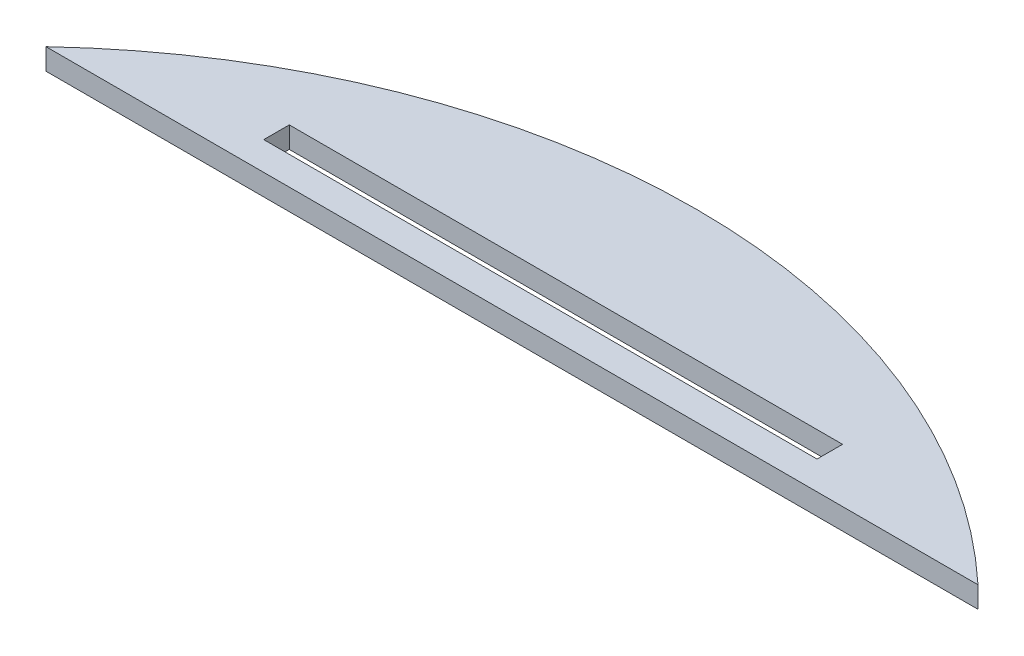
ISO-10303-21;
HEADER;
FILE_DESCRIPTION(('STEP AP214'),'2;1');
FILE_NAME('part.step','',(''),(''),'','','');
FILE_SCHEMA(('AUTOMOTIVE_DESIGN { 1 0 10303 214 1 1 1 1 }'));
ENDSEC;
DATA;
#1=APPLICATION_CONTEXT('core data for automotive mechanical design processes');
#2=APPLICATION_PROTOCOL_DEFINITION('international standard','automotive_design',2000,#1);
#3=PRODUCT_CONTEXT('',#1,'mechanical');
#4=PRODUCT('Part','Part','',(#3));
#5=PRODUCT_RELATED_PRODUCT_CATEGORY('part','',(#4));
#6=PRODUCT_DEFINITION_FORMATION('','',#4);
#7=PRODUCT_DEFINITION_CONTEXT('part definition',#1,'design');
#8=PRODUCT_DEFINITION('design','',#6,#7);
#9=PRODUCT_DEFINITION_SHAPE('','',#8);
#10=(LENGTH_UNIT() NAMED_UNIT(*) SI_UNIT(.MILLI.,.METRE.));
#11=(NAMED_UNIT(*) PLANE_ANGLE_UNIT() SI_UNIT($,.RADIAN.));
#12=(NAMED_UNIT(*) SI_UNIT($,.STERADIAN.) SOLID_ANGLE_UNIT());
#13=UNCERTAINTY_MEASURE_WITH_UNIT(LENGTH_MEASURE(1.E-05),#10,'distance_accuracy_value','');
#14=(GEOMETRIC_REPRESENTATION_CONTEXT(3) GLOBAL_UNCERTAINTY_ASSIGNED_CONTEXT((#13)) GLOBAL_UNIT_ASSIGNED_CONTEXT((#10,
#11,#12)) REPRESENTATION_CONTEXT('',''));
#15=CARTESIAN_POINT('',(0.,0.,0.));
#16=DIRECTION('',(0.,0.,1.));
#17=DIRECTION('',(1.,0.,0.));
#18=AXIS2_PLACEMENT_3D('',#15,#16,#17);
#19=CARTESIAN_POINT('',(0.,1.5,0.));
#20=DIRECTION('',(0.,-1.,0.));
#21=DIRECTION('',(0.,0.,-1.));
#22=AXIS2_PLACEMENT_3D('',#19,#20,#21);
#23=CYLINDRICAL_SURFACE('',#22,48.);
#24=CARTESIAN_POINT('',(0.,1.5,0.));
#25=DIRECTION('',(0.,1.,0.));
#26=DIRECTION('',(0.,0.,1.));
#27=AXIS2_PLACEMENT_3D('',#24,#25,#26);
#28=CIRCLE('',#27,48.);
#29=CARTESIAN_POINT('',(32.8481354113137,1.5,-35.));
#30=VERTEX_POINT('',#29);
#31=CARTESIAN_POINT('',(-32.8481354113137,1.5,-35.));
#32=VERTEX_POINT('',#31);
#33=EDGE_CURVE('E11',#30,#32,#28,.T.);
#34=ORIENTED_EDGE('',*,*,#33,.F.);
#35=DIRECTION('',(0.,1.,0.));
#36=VECTOR('',#35,1.);
#37=CARTESIAN_POINT('',(32.8481354113137,-126.905476635171,-35.));
#38=LINE('',#37,#36);
#39=CARTESIAN_POINT('',(32.8481354113137,0.,-35.));
#40=VERTEX_POINT('',#39);
#41=EDGE_CURVE('E134',#40,#30,#38,.T.);
#42=ORIENTED_EDGE('',*,*,#41,.F.);
#43=CARTESIAN_POINT('',(0.,0.,0.));
#44=DIRECTION('',(0.,1.,0.));
#45=DIRECTION('',(0.,0.,1.));
#46=AXIS2_PLACEMENT_3D('',#43,#44,#45);
#47=CIRCLE('',#46,48.);
#48=CARTESIAN_POINT('',(-32.8481354113137,0.,-35.));
#49=VERTEX_POINT('',#48);
#50=EDGE_CURVE('E41',#40,#49,#47,.T.);
#51=ORIENTED_EDGE('',*,*,#50,.T.);
#52=DIRECTION('',(0.,1.,0.));
#53=VECTOR('',#52,1.);
#54=CARTESIAN_POINT('',(-32.8481354113137,-126.905476635171,-35.));
#55=LINE('',#54,#53);
#56=EDGE_CURVE('E135',#49,#32,#55,.T.);
#57=ORIENTED_EDGE('',*,*,#56,.T.);
#58=EDGE_LOOP('',(#34,#42,#51,#57));
#59=FACE_BOUND('',#58,.T.);
#60=ADVANCED_FACE('F38',(#59),#23,.T.);
#61=CARTESIAN_POINT('',(0.,1.5,0.));
#62=DIRECTION('',(0.,1.,0.));
#63=DIRECTION('',(0.,0.,1.));
#64=AXIS2_PLACEMENT_3D('',#61,#62,#63);
#65=PLANE('',#64);
#66=DIRECTION('',(0.,0.,-1.));
#67=VECTOR('',#66,1.);
#68=CARTESIAN_POINT('',(19.5,1.5,-38.8));
#69=LINE('',#68,#67);
#70=CARTESIAN_POINT('',(19.5,1.5,-37.));
#71=VERTEX_POINT('',#70);
#72=CARTESIAN_POINT('',(19.5,1.5,-38.8));
#73=VERTEX_POINT('',#72);
#74=EDGE_CURVE('E53',#71,#73,#69,.T.);
#75=ORIENTED_EDGE('',*,*,#74,.F.);
#76=DIRECTION('',(1.,0.,0.));
#77=VECTOR('',#76,1.);
#78=CARTESIAN_POINT('',(19.5,1.5,-37.));
#79=LINE('',#78,#77);
#80=CARTESIAN_POINT('',(-19.5,1.5,-37.));
#81=VERTEX_POINT('',#80);
#82=EDGE_CURVE('E112',#81,#71,#79,.T.);
#83=ORIENTED_EDGE('',*,*,#82,.F.);
#84=DIRECTION('',(0.,0.,1.));
#85=VECTOR('',#84,1.);
#86=CARTESIAN_POINT('',(-19.5,1.5,-38.8));
#87=LINE('',#86,#85);
#88=CARTESIAN_POINT('',(-19.5,1.5,-38.8));
#89=VERTEX_POINT('',#88);
#90=EDGE_CURVE('E94',#89,#81,#87,.T.);
#91=ORIENTED_EDGE('',*,*,#90,.F.);
#92=DIRECTION('',(-1.,0.,0.));
#93=VECTOR('',#92,1.);
#94=CARTESIAN_POINT('',(19.5,1.5,-38.8));
#95=LINE('',#94,#93);
#96=EDGE_CURVE('E104',#73,#89,#95,.T.);
#97=ORIENTED_EDGE('',*,*,#96,.F.);
#98=EDGE_LOOP('',(#75,#83,#91,#97));
#99=FACE_BOUND('',#98,.T.);
#100=DIRECTION('',(-1.,0.,0.));
#101=VECTOR('',#100,1.);
#102=CARTESIAN_POINT('',(-32.8481354113137,1.5,-35.));
#103=LINE('',#102,#101);
#104=EDGE_CURVE('E130',#30,#32,#103,.T.);
#105=ORIENTED_EDGE('',*,*,#104,.F.);
#106=ORIENTED_EDGE('',*,*,#33,.T.);
#107=EDGE_LOOP('',(#105,#106));
#108=FACE_BOUND('',#107,.T.);
#109=ADVANCED_FACE('F109',(#99,#108),#65,.T.);
#110=CARTESIAN_POINT('',(0.,0.,0.));
#111=DIRECTION('',(0.,1.,0.));
#112=DIRECTION('',(0.,0.,1.));
#113=AXIS2_PLACEMENT_3D('',#110,#111,#112);
#114=PLANE('',#113);
#115=DIRECTION('',(-1.,0.,0.));
#116=VECTOR('',#115,1.);
#117=CARTESIAN_POINT('',(19.5,0.,-37.));
#118=LINE('',#117,#116);
#119=CARTESIAN_POINT('',(19.5,0.,-37.));
#120=VERTEX_POINT('',#119);
#121=CARTESIAN_POINT('',(-19.5,0.,-37.));
#122=VERTEX_POINT('',#121);
#123=EDGE_CURVE('E240',#120,#122,#118,.T.);
#124=ORIENTED_EDGE('',*,*,#123,.F.);
#125=DIRECTION('',(0.,0.,1.));
#126=VECTOR('',#125,1.);
#127=CARTESIAN_POINT('',(19.5,0.,-38.8));
#128=LINE('',#127,#126);
#129=CARTESIAN_POINT('',(19.5,0.,-38.8));
#130=VERTEX_POINT('',#129);
#131=EDGE_CURVE('E131',#130,#120,#128,.T.);
#132=ORIENTED_EDGE('',*,*,#131,.F.);
#133=DIRECTION('',(1.,0.,0.));
#134=VECTOR('',#133,1.);
#135=CARTESIAN_POINT('',(19.5,0.,-38.8));
#136=LINE('',#135,#134);
#137=CARTESIAN_POINT('',(-19.5,0.,-38.8));
#138=VERTEX_POINT('',#137);
#139=EDGE_CURVE('E127',#138,#130,#136,.T.);
#140=ORIENTED_EDGE('',*,*,#139,.F.);
#141=DIRECTION('',(0.,0.,-1.));
#142=VECTOR('',#141,1.);
#143=CARTESIAN_POINT('',(-19.5,0.,-38.8));
#144=LINE('',#143,#142);
#145=EDGE_CURVE('E97',#122,#138,#144,.T.);
#146=ORIENTED_EDGE('',*,*,#145,.F.);
#147=EDGE_LOOP('',(#124,#132,#140,#146));
#148=FACE_BOUND('',#147,.T.);
#149=ORIENTED_EDGE('',*,*,#50,.F.);
#150=DIRECTION('',(1.,0.,0.));
#151=VECTOR('',#150,1.);
#152=CARTESIAN_POINT('',(-32.8481354113137,0.,-35.));
#153=LINE('',#152,#151);
#154=EDGE_CURVE('E139',#49,#40,#153,.T.);
#155=ORIENTED_EDGE('',*,*,#154,.F.);
#156=EDGE_LOOP('',(#149,#155));
#157=FACE_BOUND('',#156,.T.);
#158=ADVANCED_FACE('F154',(#148,#157),#114,.F.);
#159=CARTESIAN_POINT('',(-32.8481354113137,-126.905476635171,-35.));
#160=DIRECTION('',(0.,0.,-1.));
#161=DIRECTION('',(-1.,0.,0.));
#162=AXIS2_PLACEMENT_3D('',#159,#160,#161);
#163=PLANE('',#162);
#164=ORIENTED_EDGE('',*,*,#154,.T.);
#165=ORIENTED_EDGE('',*,*,#41,.T.);
#166=ORIENTED_EDGE('',*,*,#104,.T.);
#167=ORIENTED_EDGE('',*,*,#56,.F.);
#168=EDGE_LOOP('',(#164,#165,#166,#167));
#169=FACE_BOUND('',#168,.T.);
#170=ADVANCED_FACE('F156',(#169),#163,.F.);
#171=CARTESIAN_POINT('',(19.5,-39.0415163639939,-38.8));
#172=DIRECTION('',(1.,0.,0.));
#173=DIRECTION('',(0.,0.,-1.));
#174=AXIS2_PLACEMENT_3D('',#171,#172,#173);
#175=PLANE('',#174);
#176=ORIENTED_EDGE('',*,*,#131,.T.);
#177=DIRECTION('',(0.,1.,0.));
#178=VECTOR('',#177,1.);
#179=CARTESIAN_POINT('',(19.5,-39.0415163639939,-37.));
#180=LINE('',#179,#178);
#181=EDGE_CURVE('E120',#120,#71,#180,.T.);
#182=ORIENTED_EDGE('',*,*,#181,.T.);
#183=ORIENTED_EDGE('',*,*,#74,.T.);
#184=DIRECTION('',(0.,1.,0.));
#185=VECTOR('',#184,1.);
#186=CARTESIAN_POINT('',(19.5,-39.0415163639939,-38.8));
#187=LINE('',#186,#185);
#188=EDGE_CURVE('E101',#130,#73,#187,.T.);
#189=ORIENTED_EDGE('',*,*,#188,.F.);
#190=EDGE_LOOP('',(#176,#182,#183,#189));
#191=FACE_BOUND('',#190,.T.);
#192=ADVANCED_FACE('F162',(#191),#175,.F.);
#193=CARTESIAN_POINT('',(19.5,-39.0415163639939,-37.));
#194=DIRECTION('',(0.,0.,1.));
#195=DIRECTION('',(1.,0.,0.));
#196=AXIS2_PLACEMENT_3D('',#193,#194,#195);
#197=PLANE('',#196);
#198=ORIENTED_EDGE('',*,*,#123,.T.);
#199=DIRECTION('',(0.,1.,0.));
#200=VECTOR('',#199,1.);
#201=CARTESIAN_POINT('',(-19.5,-39.0415163639939,-37.));
#202=LINE('',#201,#200);
#203=EDGE_CURVE('E100',#122,#81,#202,.T.);
#204=ORIENTED_EDGE('',*,*,#203,.T.);
#205=ORIENTED_EDGE('',*,*,#82,.T.);
#206=ORIENTED_EDGE('',*,*,#181,.F.);
#207=EDGE_LOOP('',(#198,#204,#205,#206));
#208=FACE_BOUND('',#207,.T.);
#209=ADVANCED_FACE('F192',(#208),#197,.F.);
#210=CARTESIAN_POINT('',(-19.5,-39.0415163639939,-38.8));
#211=DIRECTION('',(-1.,0.,0.));
#212=DIRECTION('',(0.,0.,1.));
#213=AXIS2_PLACEMENT_3D('',#210,#211,#212);
#214=PLANE('',#213);
#215=ORIENTED_EDGE('',*,*,#145,.T.);
#216=DIRECTION('',(0.,1.,0.));
#217=VECTOR('',#216,1.);
#218=CARTESIAN_POINT('',(-19.5,-39.0415163639939,-38.8));
#219=LINE('',#218,#217);
#220=EDGE_CURVE('E61',#138,#89,#219,.T.);
#221=ORIENTED_EDGE('',*,*,#220,.T.);
#222=ORIENTED_EDGE('',*,*,#90,.T.);
#223=ORIENTED_EDGE('',*,*,#203,.F.);
#224=EDGE_LOOP('',(#215,#221,#222,#223));
#225=FACE_BOUND('',#224,.T.);
#226=ADVANCED_FACE('F91',(#225),#214,.F.);
#227=CARTESIAN_POINT('',(19.5,-39.0415163639939,-38.8));
#228=DIRECTION('',(0.,0.,-1.));
#229=DIRECTION('',(-1.,0.,0.));
#230=AXIS2_PLACEMENT_3D('',#227,#228,#229);
#231=PLANE('',#230);
#232=ORIENTED_EDGE('',*,*,#139,.T.);
#233=ORIENTED_EDGE('',*,*,#188,.T.);
#234=ORIENTED_EDGE('',*,*,#96,.T.);
#235=ORIENTED_EDGE('',*,*,#220,.F.);
#236=EDGE_LOOP('',(#232,#233,#234,#235));
#237=FACE_BOUND('',#236,.T.);
#238=ADVANCED_FACE('F105',(#237),#231,.F.);
#239=CLOSED_SHELL('',(#60,#109,#158,#170,#192,#209,#226,#238));
#240=MANIFOLD_SOLID_BREP('B2',#239);
#241=ADVANCED_BREP_SHAPE_REPRESENTATION('',(#18,#240),#14);
#242=SHAPE_DEFINITION_REPRESENTATION(#9,#241);
ENDSEC;
END-ISO-10303-21;
